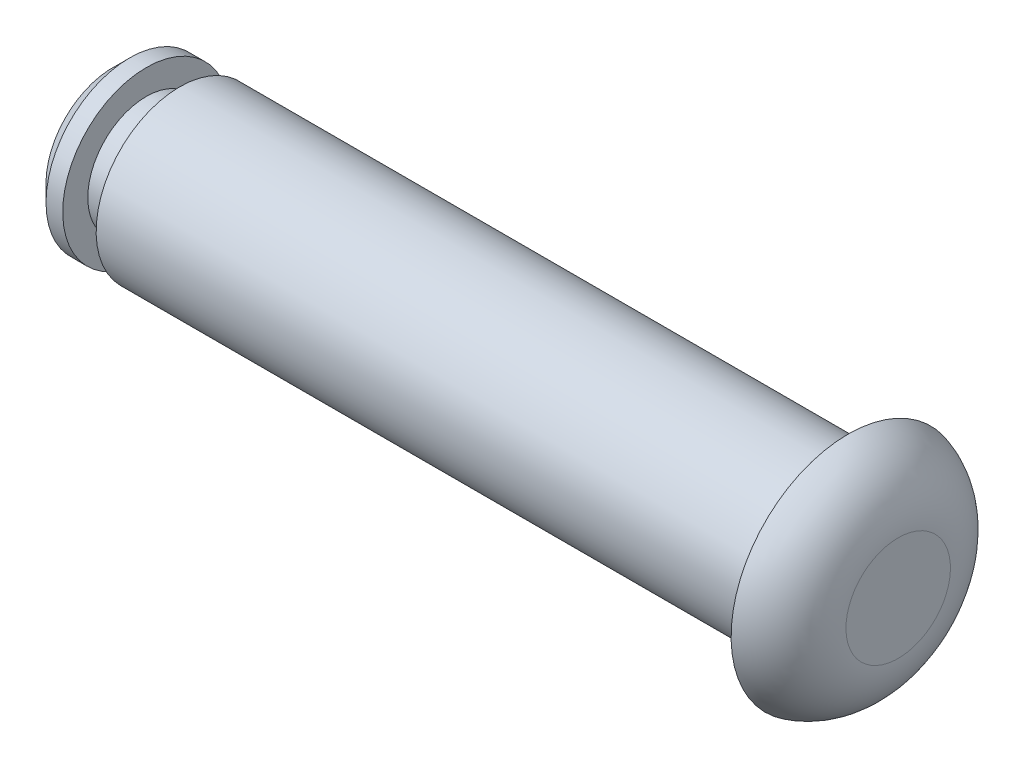
ISO-10303-21;
HEADER;
FILE_DESCRIPTION(('STEP AP214'),'2;1');
FILE_NAME('part.step','',(''),(''),'','','');
FILE_SCHEMA(('AUTOMOTIVE_DESIGN { 1 0 10303 214 1 1 1 1 }'));
ENDSEC;
DATA;
#1=APPLICATION_CONTEXT('core data for automotive mechanical design processes');
#2=APPLICATION_PROTOCOL_DEFINITION('international standard','automotive_design',2000,#1);
#3=PRODUCT_CONTEXT('',#1,'mechanical');
#4=PRODUCT('Part','Part','',(#3));
#5=PRODUCT_RELATED_PRODUCT_CATEGORY('part','',(#4));
#6=PRODUCT_DEFINITION_FORMATION('','',#4);
#7=PRODUCT_DEFINITION_CONTEXT('part definition',#1,'design');
#8=PRODUCT_DEFINITION('design','',#6,#7);
#9=PRODUCT_DEFINITION_SHAPE('','',#8);
#10=(LENGTH_UNIT() NAMED_UNIT(*) SI_UNIT(.MILLI.,.METRE.));
#11=(NAMED_UNIT(*) PLANE_ANGLE_UNIT() SI_UNIT($,.RADIAN.));
#12=(NAMED_UNIT(*) SI_UNIT($,.STERADIAN.) SOLID_ANGLE_UNIT());
#13=UNCERTAINTY_MEASURE_WITH_UNIT(LENGTH_MEASURE(1.E-05),#10,'distance_accuracy_value','');
#14=(GEOMETRIC_REPRESENTATION_CONTEXT(3) GLOBAL_UNCERTAINTY_ASSIGNED_CONTEXT((#13)) GLOBAL_UNIT_ASSIGNED_CONTEXT((#10,
#11,#12)) REPRESENTATION_CONTEXT('',''));
#15=CARTESIAN_POINT('',(0.,0.,0.));
#16=DIRECTION('',(0.,0.,1.));
#17=DIRECTION('',(1.,0.,0.));
#18=AXIS2_PLACEMENT_3D('',#15,#16,#17);
#19=CARTESIAN_POINT('',(0.,0.,0.));
#20=DIRECTION('',(-1.,0.,0.));
#21=DIRECTION('',(0.,-1.,0.));
#22=AXIS2_PLACEMENT_3D('',#19,#20,#21);
#23=PLANE('',#22);
#24=CARTESIAN_POINT('',(0.,0.,0.));
#25=DIRECTION('',(-1.,0.,0.));
#26=DIRECTION('',(0.,-1.,0.));
#27=AXIS2_PLACEMENT_3D('',#24,#25,#26);
#28=CIRCLE('',#27,1.99999999999999);
#29=CARTESIAN_POINT('',(0.,-1.99999999999999,0.));
#30=VERTEX_POINT('',#29);
#31=EDGE_CURVE('E10',#30,#30,#28,.T.);
#32=ORIENTED_EDGE('',*,*,#31,.T.);
#33=EDGE_LOOP('',(#32));
#34=FACE_BOUND('',#33,.T.);
#35=ADVANCED_FACE('F39',(#34),#23,.T.);
#36=CARTESIAN_POINT('',(23.5,0.,0.));
#37=DIRECTION('',(1.,0.,0.));
#38=DIRECTION('',(0.,1.,0.));
#39=AXIS2_PLACEMENT_3D('',#36,#37,#38);
#40=CYLINDRICAL_SURFACE('',#39,2.5);
#41=CARTESIAN_POINT('',(0.500000000000007,0.,0.));
#42=DIRECTION('',(-1.,0.,0.));
#43=DIRECTION('',(0.,-1.,0.));
#44=AXIS2_PLACEMENT_3D('',#41,#42,#43);
#45=CIRCLE('',#44,2.5);
#46=CARTESIAN_POINT('',(0.500000000000007,-2.5,0.));
#47=VERTEX_POINT('',#46);
#48=EDGE_CURVE('E47',#47,#47,#45,.F.);
#49=ORIENTED_EDGE('',*,*,#48,.T.);
#50=EDGE_LOOP('',(#49));
#51=FACE_BOUND('',#50,.T.);
#52=CARTESIAN_POINT('',(1.,0.,0.));
#53=DIRECTION('',(1.,0.,0.));
#54=DIRECTION('',(0.,1.,0.));
#55=AXIS2_PLACEMENT_3D('',#52,#53,#54);
#56=CIRCLE('',#55,2.5);
#57=CARTESIAN_POINT('',(1.,2.5,0.));
#58=VERTEX_POINT('',#57);
#59=EDGE_CURVE('E55',#58,#58,#56,.T.);
#60=ORIENTED_EDGE('',*,*,#59,.F.);
#61=EDGE_LOOP('',(#60));
#62=FACE_BOUND('',#61,.T.);
#63=ADVANCED_FACE('F95',(#51,#62),#40,.T.);
#64=CARTESIAN_POINT('',(1.,2.5,0.));
#65=DIRECTION('',(1.,0.,0.));
#66=DIRECTION('',(0.,1.,0.));
#67=AXIS2_PLACEMENT_3D('',#64,#65,#66);
#68=PLANE('',#67);
#69=ORIENTED_EDGE('',*,*,#59,.T.);
#70=EDGE_LOOP('',(#69));
#71=FACE_BOUND('',#70,.T.);
#72=CARTESIAN_POINT('',(1.,0.,0.));
#73=DIRECTION('',(1.,0.,0.));
#74=DIRECTION('',(0.,1.,0.));
#75=AXIS2_PLACEMENT_3D('',#72,#73,#74);
#76=CIRCLE('',#75,1.75);
#77=CARTESIAN_POINT('',(1.,1.75,0.));
#78=VERTEX_POINT('',#77);
#79=EDGE_CURVE('E60',#78,#78,#76,.T.);
#80=ORIENTED_EDGE('',*,*,#79,.F.);
#81=EDGE_LOOP('',(#80));
#82=FACE_BOUND('',#81,.T.);
#83=ADVANCED_FACE('F101',(#71,#82),#68,.T.);
#84=CARTESIAN_POINT('',(23.5,0.,0.));
#85=DIRECTION('',(1.,0.,0.));
#86=DIRECTION('',(0.,1.,0.));
#87=AXIS2_PLACEMENT_3D('',#84,#85,#86);
#88=CYLINDRICAL_SURFACE('',#87,1.75);
#89=ORIENTED_EDGE('',*,*,#79,.T.);
#90=EDGE_LOOP('',(#89));
#91=FACE_BOUND('',#90,.T.);
#92=CARTESIAN_POINT('',(2.,0.,0.));
#93=DIRECTION('',(1.,0.,0.));
#94=DIRECTION('',(0.,1.,0.));
#95=AXIS2_PLACEMENT_3D('',#92,#93,#94);
#96=CIRCLE('',#95,1.75);
#97=CARTESIAN_POINT('',(2.,1.75,0.));
#98=VERTEX_POINT('',#97);
#99=EDGE_CURVE('E63',#98,#98,#96,.T.);
#100=ORIENTED_EDGE('',*,*,#99,.F.);
#101=EDGE_LOOP('',(#100));
#102=FACE_BOUND('',#101,.T.);
#103=ADVANCED_FACE('F129',(#91,#102),#88,.T.);
#104=CARTESIAN_POINT('',(2.,1.75,0.));
#105=DIRECTION('',(-1.,0.,0.));
#106=DIRECTION('',(0.,-1.,0.));
#107=AXIS2_PLACEMENT_3D('',#104,#105,#106);
#108=PLANE('',#107);
#109=ORIENTED_EDGE('',*,*,#99,.T.);
#110=EDGE_LOOP('',(#109));
#111=FACE_BOUND('',#110,.T.);
#112=CARTESIAN_POINT('',(2.,0.,0.));
#113=DIRECTION('',(1.,0.,0.));
#114=DIRECTION('',(0.,1.,0.));
#115=AXIS2_PLACEMENT_3D('',#112,#113,#114);
#116=CIRCLE('',#115,2.5);
#117=CARTESIAN_POINT('',(2.,2.5,0.));
#118=VERTEX_POINT('',#117);
#119=EDGE_CURVE('E66',#118,#118,#116,.T.);
#120=ORIENTED_EDGE('',*,*,#119,.F.);
#121=EDGE_LOOP('',(#120));
#122=FACE_BOUND('',#121,.T.);
#123=ADVANCED_FACE('F91',(#111,#122),#108,.T.);
#124=CARTESIAN_POINT('',(23.5,0.,0.));
#125=DIRECTION('',(1.,0.,0.));
#126=DIRECTION('',(0.,1.,0.));
#127=AXIS2_PLACEMENT_3D('',#124,#125,#126);
#128=CYLINDRICAL_SURFACE('',#127,2.5);
#129=ORIENTED_EDGE('',*,*,#119,.T.);
#130=EDGE_LOOP('',(#129));
#131=FACE_BOUND('',#130,.T.);
#132=CARTESIAN_POINT('',(22.,0.,0.));
#133=DIRECTION('',(1.,0.,0.));
#134=DIRECTION('',(0.,1.,0.));
#135=AXIS2_PLACEMENT_3D('',#132,#133,#134);
#136=CIRCLE('',#135,2.5);
#137=CARTESIAN_POINT('',(22.,2.5,0.));
#138=VERTEX_POINT('',#137);
#139=EDGE_CURVE('E69',#138,#138,#136,.T.);
#140=ORIENTED_EDGE('',*,*,#139,.F.);
#141=EDGE_LOOP('',(#140));
#142=FACE_BOUND('',#141,.T.);
#143=ADVANCED_FACE('F82',(#131,#142),#128,.T.);
#144=CARTESIAN_POINT('',(22.,2.5,0.));
#145=DIRECTION('',(-1.,0.,0.));
#146=DIRECTION('',(0.,-1.,0.));
#147=AXIS2_PLACEMENT_3D('',#144,#145,#146);
#148=PLANE('',#147);
#149=ORIENTED_EDGE('',*,*,#139,.T.);
#150=EDGE_LOOP('',(#149));
#151=FACE_BOUND('',#150,.T.);
#152=CARTESIAN_POINT('',(22.,0.,0.));
#153=DIRECTION('',(1.,0.,0.));
#154=DIRECTION('',(0.,1.,0.));
#155=AXIS2_PLACEMENT_3D('',#152,#153,#154);
#156=CIRCLE('',#155,3.5);
#157=CARTESIAN_POINT('',(22.,3.5,0.));
#158=VERTEX_POINT('',#157);
#159=EDGE_CURVE('E72',#158,#158,#156,.T.);
#160=ORIENTED_EDGE('',*,*,#159,.F.);
#161=EDGE_LOOP('',(#160));
#162=FACE_BOUND('',#161,.T.);
#163=ADVANCED_FACE('F79',(#151,#162),#148,.T.);
#164=CARTESIAN_POINT('',(23.5,3.5,0.));
#165=DIRECTION('',(1.,0.,0.));
#166=DIRECTION('',(0.,1.,0.));
#167=AXIS2_PLACEMENT_3D('',#164,#165,#166);
#168=PLANE('',#167);
#169=CARTESIAN_POINT('',(23.5,0.,0.));
#170=DIRECTION('',(1.,0.,0.));
#171=DIRECTION('',(0.,1.,0.));
#172=AXIS2_PLACEMENT_3D('',#169,#170,#171);
#173=CIRCLE('',#172,1.56350832689629);
#174=CARTESIAN_POINT('',(23.5,1.56350832689629,0.));
#175=VERTEX_POINT('',#174);
#176=EDGE_CURVE('E51',#175,#175,#173,.T.);
#177=ORIENTED_EDGE('',*,*,#176,.T.);
#178=EDGE_LOOP('',(#177));
#179=FACE_BOUND('',#178,.T.);
#180=ADVANCED_FACE('F81',(#179),#168,.T.);
#181=CARTESIAN_POINT('',(21.5,0.,0.));
#182=DIRECTION('',(-1.,0.,0.));
#183=DIRECTION('',(0.,-1.,0.));
#184=AXIS2_PLACEMENT_3D('',#181,#182,#183);
#185=DEGENERATE_TOROIDAL_SURFACE('',#184,1.56350832689629,2.,.T.);
#186=ORIENTED_EDGE('',*,*,#159,.T.);
#187=EDGE_LOOP('',(#186));
#188=FACE_BOUND('',#187,.T.);
#189=ORIENTED_EDGE('',*,*,#176,.F.);
#190=EDGE_LOOP('',(#189));
#191=FACE_BOUND('',#190,.T.);
#192=ADVANCED_FACE('F76',(#188,#191),#185,.T.);
#193=CARTESIAN_POINT('',(0.500000000000007,0.,0.));
#194=DIRECTION('',(1.,0.,0.));
#195=DIRECTION('',(0.,1.,0.));
#196=AXIS2_PLACEMENT_3D('',#193,#194,#195);
#197=CONICAL_SURFACE('',#196,2.5,0.78539816339745);
#198=ORIENTED_EDGE('',*,*,#31,.F.);
#199=EDGE_LOOP('',(#198));
#200=FACE_BOUND('',#199,.T.);
#201=ORIENTED_EDGE('',*,*,#48,.F.);
#202=EDGE_LOOP('',(#201));
#203=FACE_BOUND('',#202,.T.);
#204=ADVANCED_FACE('F42',(#200,#203),#197,.T.);
#205=CLOSED_SHELL('',(#35,#63,#83,#103,#123,#143,#163,#180,#192,#204));
#206=MANIFOLD_SOLID_BREP('B2',#205);
#207=ADVANCED_BREP_SHAPE_REPRESENTATION('',(#18,#206),#14);
#208=SHAPE_DEFINITION_REPRESENTATION(#9,#207);
ENDSEC;
END-ISO-10303-21;
